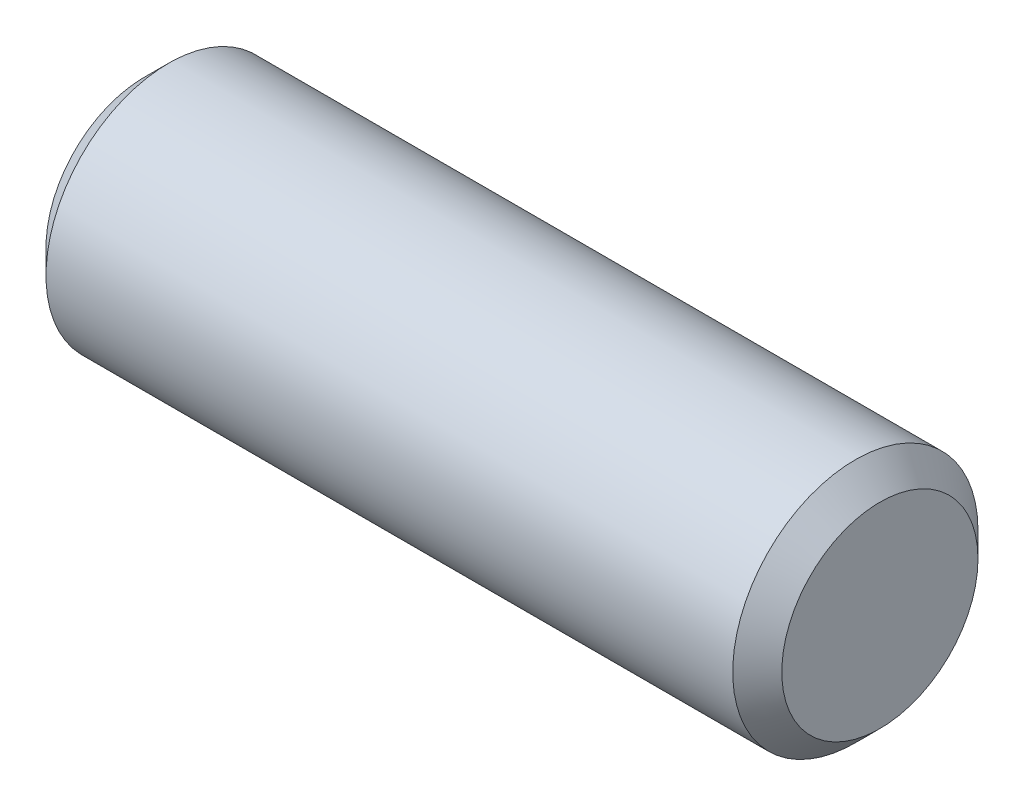
ISO-10303-21;
HEADER;
FILE_DESCRIPTION(('STEP AP214'),'2;1');
FILE_NAME('part.step','',(''),(''),'','','');
FILE_SCHEMA(('AUTOMOTIVE_DESIGN { 1 0 10303 214 1 1 1 1 }'));
ENDSEC;
DATA;
#1=APPLICATION_CONTEXT('core data for automotive mechanical design processes');
#2=APPLICATION_PROTOCOL_DEFINITION('international standard','automotive_design',2000,#1);
#3=PRODUCT_CONTEXT('',#1,'mechanical');
#4=PRODUCT('Part','Part','',(#3));
#5=PRODUCT_RELATED_PRODUCT_CATEGORY('part','',(#4));
#6=PRODUCT_DEFINITION_FORMATION('','',#4);
#7=PRODUCT_DEFINITION_CONTEXT('part definition',#1,'design');
#8=PRODUCT_DEFINITION('design','',#6,#7);
#9=PRODUCT_DEFINITION_SHAPE('','',#8);
#10=(LENGTH_UNIT() NAMED_UNIT(*) SI_UNIT(.MILLI.,.METRE.));
#11=(NAMED_UNIT(*) PLANE_ANGLE_UNIT() SI_UNIT($,.RADIAN.));
#12=(NAMED_UNIT(*) SI_UNIT($,.STERADIAN.) SOLID_ANGLE_UNIT());
#13=UNCERTAINTY_MEASURE_WITH_UNIT(LENGTH_MEASURE(1.E-05),#10,'distance_accuracy_value','');
#14=(GEOMETRIC_REPRESENTATION_CONTEXT(3) GLOBAL_UNCERTAINTY_ASSIGNED_CONTEXT((#13)) GLOBAL_UNIT_ASSIGNED_CONTEXT((#10,
#11,#12)) REPRESENTATION_CONTEXT('',''));
#15=CARTESIAN_POINT('',(0.,0.,0.));
#16=DIRECTION('',(0.,0.,1.));
#17=DIRECTION('',(1.,0.,0.));
#18=AXIS2_PLACEMENT_3D('',#15,#16,#17);
#19=CARTESIAN_POINT('',(-1.190625,0.,0.));
#20=DIRECTION('',(1.,0.,0.));
#21=DIRECTION('',(0.,0.,-1.));
#22=AXIS2_PLACEMENT_3D('',#19,#20,#21);
#23=CYLINDRICAL_SURFACE('',#22,0.396875);
#24=CARTESIAN_POINT('',(1.11125,0.,0.));
#25=DIRECTION('',(1.,0.,0.));
#26=DIRECTION('',(0.,0.,-1.));
#27=AXIS2_PLACEMENT_3D('',#24,#25,#26);
#28=CIRCLE('',#27,0.396875);
#29=CARTESIAN_POINT('',(1.11125,0.,-0.396875));
#30=VERTEX_POINT('',#29);
#31=EDGE_CURVE('E43',#30,#30,#28,.F.);
#32=ORIENTED_EDGE('',*,*,#31,.T.);
#33=EDGE_LOOP('',(#32));
#34=FACE_BOUND('',#33,.T.);
#35=CARTESIAN_POINT('',(-1.11125,0.,0.));
#36=DIRECTION('',(1.,0.,0.));
#37=DIRECTION('',(0.,0.,-1.));
#38=AXIS2_PLACEMENT_3D('',#35,#36,#37);
#39=CIRCLE('',#38,0.396875);
#40=CARTESIAN_POINT('',(-1.11125,0.,-0.396875));
#41=VERTEX_POINT('',#40);
#42=EDGE_CURVE('E47',#41,#41,#39,.T.);
#43=ORIENTED_EDGE('',*,*,#42,.T.);
#44=EDGE_LOOP('',(#43));
#45=FACE_BOUND('',#44,.T.);
#46=ADVANCED_FACE('F36',(#34,#45),#23,.T.);
#47=CARTESIAN_POINT('',(-1.190625,0.,0.));
#48=DIRECTION('',(1.,0.,0.));
#49=DIRECTION('',(0.,0.,-1.));
#50=AXIS2_PLACEMENT_3D('',#47,#48,#49);
#51=PLANE('',#50);
#52=CARTESIAN_POINT('',(-1.190625,0.,0.));
#53=DIRECTION('',(1.,0.,0.));
#54=DIRECTION('',(0.,0.,-1.));
#55=AXIS2_PLACEMENT_3D('',#52,#53,#54);
#56=CIRCLE('',#55,0.3175);
#57=CARTESIAN_POINT('',(-1.190625,0.,-0.3175));
#58=VERTEX_POINT('',#57);
#59=EDGE_CURVE('E10',#58,#58,#56,.F.);
#60=ORIENTED_EDGE('',*,*,#59,.T.);
#61=EDGE_LOOP('',(#60));
#62=FACE_BOUND('',#61,.T.);
#63=ADVANCED_FACE('F67',(#62),#51,.F.);
#64=CARTESIAN_POINT('',(1.190625,0.,0.));
#65=DIRECTION('',(1.,0.,0.));
#66=DIRECTION('',(0.,0.,-1.));
#67=AXIS2_PLACEMENT_3D('',#64,#65,#66);
#68=PLANE('',#67);
#69=CARTESIAN_POINT('',(1.190625,0.,0.));
#70=DIRECTION('',(1.,0.,0.));
#71=DIRECTION('',(0.,0.,-1.));
#72=AXIS2_PLACEMENT_3D('',#69,#70,#71);
#73=CIRCLE('',#72,0.3175);
#74=CARTESIAN_POINT('',(1.190625,0.,-0.3175));
#75=VERTEX_POINT('',#74);
#76=EDGE_CURVE('E51',#75,#75,#73,.T.);
#77=ORIENTED_EDGE('',*,*,#76,.T.);
#78=EDGE_LOOP('',(#77));
#79=FACE_BOUND('',#78,.T.);
#80=ADVANCED_FACE('F57',(#79),#68,.T.);
#81=CARTESIAN_POINT('',(1.190625,0.,0.));
#82=DIRECTION('',(-1.,0.,0.));
#83=DIRECTION('',(0.,0.,1.));
#84=AXIS2_PLACEMENT_3D('',#81,#82,#83);
#85=CONICAL_SURFACE('',#84,0.3175,0.785398163397446);
#86=ORIENTED_EDGE('',*,*,#31,.F.);
#87=EDGE_LOOP('',(#86));
#88=FACE_BOUND('',#87,.T.);
#89=ORIENTED_EDGE('',*,*,#76,.F.);
#90=EDGE_LOOP('',(#89));
#91=FACE_BOUND('',#90,.T.);
#92=ADVANCED_FACE('F59',(#88,#91),#85,.T.);
#93=CARTESIAN_POINT('',(-1.11125,0.,0.));
#94=DIRECTION('',(1.,0.,0.));
#95=DIRECTION('',(0.,0.,-1.));
#96=AXIS2_PLACEMENT_3D('',#93,#94,#95);
#97=CONICAL_SURFACE('',#96,0.396875,0.78539816339745);
#98=ORIENTED_EDGE('',*,*,#59,.F.);
#99=EDGE_LOOP('',(#98));
#100=FACE_BOUND('',#99,.T.);
#101=ORIENTED_EDGE('',*,*,#42,.F.);
#102=EDGE_LOOP('',(#101));
#103=FACE_BOUND('',#102,.T.);
#104=ADVANCED_FACE('F38',(#100,#103),#97,.T.);
#105=CLOSED_SHELL('',(#46,#63,#80,#92,#104));
#106=MANIFOLD_SOLID_BREP('B2',#105);
#107=ADVANCED_BREP_SHAPE_REPRESENTATION('',(#18,#106),#14);
#108=SHAPE_DEFINITION_REPRESENTATION(#9,#107);
ENDSEC;
END-ISO-10303-21;
